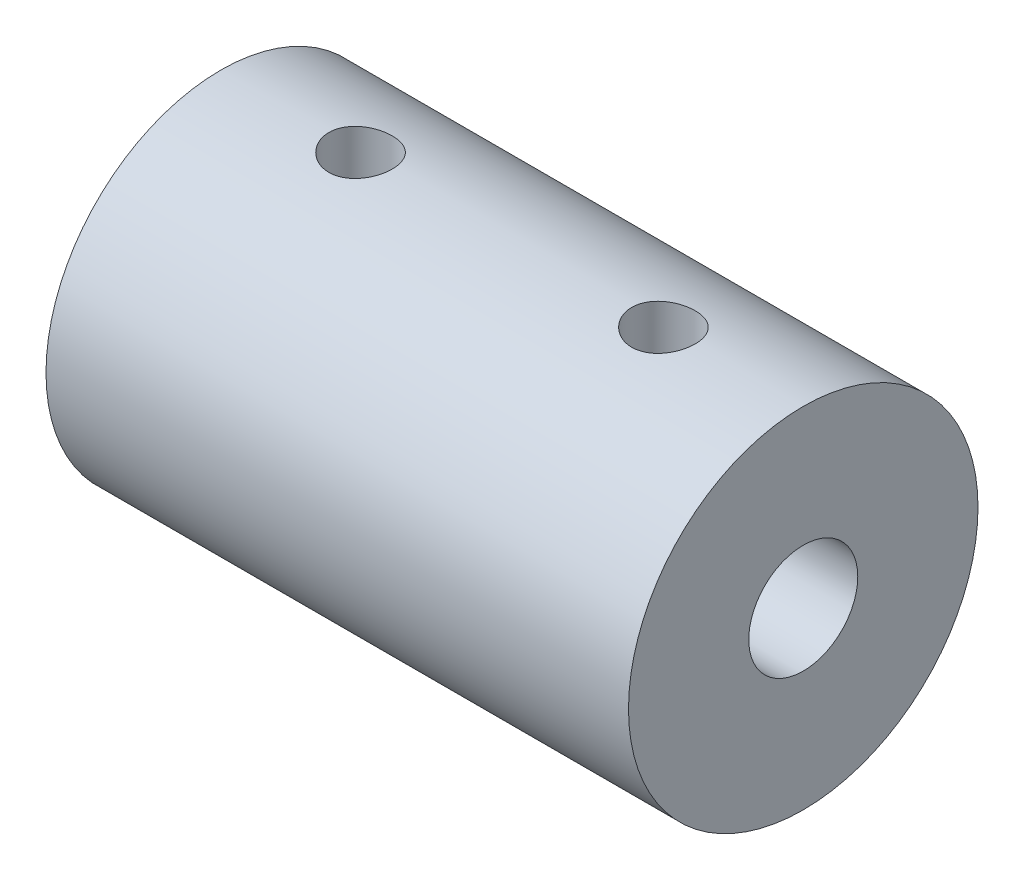
ISO-10303-21;
HEADER;
FILE_DESCRIPTION(('STEP AP214'),'2;1');
FILE_NAME('part.step','',(''),(''),'','','');
FILE_SCHEMA(('AUTOMOTIVE_DESIGN { 1 0 10303 214 1 1 1 1 }'));
ENDSEC;
DATA;
#1=APPLICATION_CONTEXT('core data for automotive mechanical design processes');
#2=APPLICATION_PROTOCOL_DEFINITION('international standard','automotive_design',2000,#1);
#3=PRODUCT_CONTEXT('',#1,'mechanical');
#4=PRODUCT('Part','Part','',(#3));
#5=PRODUCT_RELATED_PRODUCT_CATEGORY('part','',(#4));
#6=PRODUCT_DEFINITION_FORMATION('','',#4);
#7=PRODUCT_DEFINITION_CONTEXT('part definition',#1,'design');
#8=PRODUCT_DEFINITION('design','',#6,#7);
#9=PRODUCT_DEFINITION_SHAPE('','',#8);
#10=(LENGTH_UNIT() NAMED_UNIT(*) SI_UNIT(.MILLI.,.METRE.));
#11=(NAMED_UNIT(*) PLANE_ANGLE_UNIT() SI_UNIT($,.RADIAN.));
#12=(NAMED_UNIT(*) SI_UNIT($,.STERADIAN.) SOLID_ANGLE_UNIT());
#13=UNCERTAINTY_MEASURE_WITH_UNIT(LENGTH_MEASURE(1.E-05),#10,'distance_accuracy_value','');
#14=(GEOMETRIC_REPRESENTATION_CONTEXT(3) GLOBAL_UNCERTAINTY_ASSIGNED_CONTEXT((#13)) GLOBAL_UNIT_ASSIGNED_CONTEXT((#10,
#11,#12)) REPRESENTATION_CONTEXT('',''));
#15=CARTESIAN_POINT('',(0.,0.,0.));
#16=DIRECTION('',(0.,0.,1.));
#17=DIRECTION('',(1.,0.,0.));
#18=AXIS2_PLACEMENT_3D('',#15,#16,#17);
#19=CARTESIAN_POINT('',(15.875,0.,0.));
#20=DIRECTION('',(-1.,0.,0.));
#21=DIRECTION('',(0.,0.,1.));
#22=AXIS2_PLACEMENT_3D('',#19,#20,#21);
#23=CYLINDRICAL_SURFACE('',#22,9.525);
#24=CARTESIAN_POINT('',(-8.255,9.36709160625645,1.72719999999999));
#25=CARTESIAN_POINT('',(-8.35115795474129,9.36709343497364,1.72719625390079));
#26=CARTESIAN_POINT('',(-8.44736520185399,9.36858834082511,1.71914270536416));
#27=CARTESIAN_POINT('',(-8.63707101764501,9.37439961656139,1.68716062987503));
#28=CARTESIAN_POINT('',(-8.73056715290708,9.37871844395448,1.66321827547112));
#29=CARTESIAN_POINT('',(-8.91207824297073,9.38967270270374,1.6002145457144));
#30=CARTESIAN_POINT('',(-9.00009805868919,9.39630604404906,1.56116680710868));
#31=CARTESIAN_POINT('',(-9.16833051207764,9.41113944883253,1.46909622360217));
#32=CARTESIAN_POINT('',(-9.248543840492,9.41933937346351,1.41607461669867));
#33=CARTESIAN_POINT('',(-9.3998276902941,9.43648870802808,1.29690299865099));
#34=CARTESIAN_POINT('',(-9.47079408645016,9.44544504519133,1.23062178201328));
#35=CARTESIAN_POINT('',(-9.6006632394337,9.46303676260904,1.08709600230992));
#36=CARTESIAN_POINT('',(-9.65956522859206,9.47167212241083,1.00985074212138));
#37=CARTESIAN_POINT('',(-9.76403010266554,9.48772286083563,0.845908417592046));
#38=CARTESIAN_POINT('',(-9.80949519272308,9.49512913111047,0.75914806985368));
#39=CARTESIAN_POINT('',(-9.88516607834458,9.50780980092821,0.579064151305445));
#40=CARTESIAN_POINT('',(-9.91537304728019,9.51308436439624,0.485741085807066));
#41=CARTESIAN_POINT('',(-9.95934929684985,9.52085839899594,0.296258940572087));
#42=CARTESIAN_POINT('',(-9.9732939470057,9.52338745615763,0.200141795565415));
#43=CARTESIAN_POINT('',(-9.98489580828946,9.52548739851328,0.00690112682949754));
#44=CARTESIAN_POINT('',(-9.98255432031225,9.52505851997957,-0.0902223159004717));
#45=CARTESIAN_POINT('',(-9.96178556574876,9.52131412657413,-0.28151705155413));
#46=CARTESIAN_POINT('',(-9.94354709762688,9.51803249328916,-0.375709600922653));
#47=CARTESIAN_POINT('',(-9.89180030265221,9.50898923828882,-0.559674826749761));
#48=CARTESIAN_POINT('',(-9.85829144637045,9.50322753058892,-0.649447349845121));
#49=CARTESIAN_POINT('',(-9.77677280931975,9.48981454472941,-0.822576095350367));
#50=CARTESIAN_POINT('',(-9.72868684425516,9.48215337870742,-0.905895648642475));
#51=CARTESIAN_POINT('',(-9.61943500589909,9.46578994716391,-1.06335388456352));
#52=CARTESIAN_POINT('',(-9.55826788551003,9.45708758241411,-1.13749169078174));
#53=CARTESIAN_POINT('',(-9.42354754616279,9.43945949798295,-1.27559962395483));
#54=CARTESIAN_POINT('',(-9.34982919582557,9.43053236513762,-1.33940859362493));
#55=CARTESIAN_POINT('',(-9.19265099867967,9.4135806781254,-1.45378019679795));
#56=CARTESIAN_POINT('',(-9.10919102696789,9.40555613553374,-1.50434266043259));
#57=CARTESIAN_POINT('',(-8.93469331221902,9.39131652514842,-1.59082748215016));
#58=CARTESIAN_POINT('',(-8.84364433842957,9.38510420260575,-1.62672766156755));
#59=CARTESIAN_POINT('',(-8.65666946975143,9.37523540246148,-1.68267680476975));
#60=CARTESIAN_POINT('',(-8.56074409020495,9.37157865538462,-1.70272743985513));
#61=CARTESIAN_POINT('',(-8.36818912967723,9.36728800663201,-1.7261756208229));
#62=CARTESIAN_POINT('',(-8.27158858181781,9.36661218161772,-1.72980414446771));
#63=CARTESIAN_POINT('',(-8.07916152655703,9.36824787109065,-1.72092314584178));
#64=CARTESIAN_POINT('',(-7.98333498368581,9.3705592478946,-1.70841436735625));
#65=CARTESIAN_POINT('',(-7.79592753163355,9.37786995345022,-1.66781172201954));
#66=CARTESIAN_POINT('',(-7.70431974379931,9.38284857668978,-1.63983785607877));
#67=CARTESIAN_POINT('',(-7.52709171950237,9.39491511594552,-1.56922598156164));
#68=CARTESIAN_POINT('',(-7.44147189973352,9.40200317857446,-1.52658695367775));
#69=CARTESIAN_POINT('',(-7.27762946644026,9.41758601931965,-1.42731936031377));
#70=CARTESIAN_POINT('',(-7.1994970458319,9.42609520608484,-1.37054423426629));
#71=CARTESIAN_POINT('',(-7.0537848670088,9.44352050720455,-1.24481479182017));
#72=CARTESIAN_POINT('',(-6.98620599447276,9.45243665563121,-1.17585945426315));
#73=CARTESIAN_POINT('',(-6.86266230694343,9.46980532958425,-1.02669788710214));
#74=CARTESIAN_POINT('',(-6.80685243693567,9.4782507074214,-0.946362361724642));
#75=CARTESIAN_POINT('',(-6.70952198072541,9.49360778801081,-0.777321261465812));
#76=CARTESIAN_POINT('',(-6.66800086999375,9.5005195470577,-0.688615993983514));
#77=CARTESIAN_POINT('',(-6.600661352377,9.5119997827441,-0.505791398298495));
#78=CARTESIAN_POINT('',(-6.57476532541818,9.51657982450963,-0.411701417633637));
#79=CARTESIAN_POINT('',(-6.53916261623354,9.5229297822828,-0.220417190627488));
#80=CARTESIAN_POINT('',(-6.52945434552246,9.52469997401686,-0.123223249828148));
#81=CARTESIAN_POINT('',(-6.52655509281603,9.52522578442471,0.0700211002257293));
#82=CARTESIAN_POINT('',(-6.5331295686287,9.52402420977396,0.166067953481926));
#83=CARTESIAN_POINT('',(-6.56209746266059,9.5188299635943,0.355664671688566));
#84=CARTESIAN_POINT('',(-6.58449074985277,9.51483731518381,0.449214557314702));
#85=CARTESIAN_POINT('',(-6.64436441858851,9.50450894130173,0.631048360872217));
#86=CARTESIAN_POINT('',(-6.68182136680741,9.49817685634161,0.719340214503601));
#87=CARTESIAN_POINT('',(-6.77073163592665,9.4838568277767,0.88842134092432));
#88=CARTESIAN_POINT('',(-6.82218581228916,9.47586878297248,0.969210154748872));
#89=CARTESIAN_POINT('',(-6.93844476760439,9.45898406813173,1.12216470349717));
#90=CARTESIAN_POINT('',(-7.00341973104658,9.45007662637111,1.19419990890147));
#91=CARTESIAN_POINT('',(-7.14452129311012,9.43242700134796,1.32642635353507));
#92=CARTESIAN_POINT('',(-7.22065050546256,9.42368485736257,1.38661480899465));
#93=CARTESIAN_POINT('',(-7.38267800891623,9.40727413159174,1.49392054475152));
#94=CARTESIAN_POINT('',(-7.46865437218685,9.39961538398545,1.54092148039362));
#95=CARTESIAN_POINT('',(-7.64739165336194,9.38635619964863,1.61973853052233));
#96=CARTESIAN_POINT('',(-7.74014595185666,9.38075378605842,1.6515692377648));
#97=CARTESIAN_POINT('',(-7.90350180935456,9.37343285236402,1.69253544616144));
#98=CARTESIAN_POINT('',(-7.97313630309745,9.37106872526291,1.70551282132508));
#99=CARTESIAN_POINT('',(-8.11350498469122,9.3678974481759,1.72284637234295));
#100=CARTESIAN_POINT('',(-8.18423914590635,9.36709026053741,1.72720275668487));
#101=CARTESIAN_POINT('',(-8.255,9.36709160625645,1.72719999999999));
#102=B_SPLINE_CURVE_WITH_KNOTS('',3,(#24,#25,#26,#27,#28,#29,#30,#31,#32,#33,#34,#35,#36,#37,
#38,#39,#40,#41,#42,#43,#44,#45,#46,#47,#48,#49,#50,#51,#52,#53,#54,#55,#56,#57,#58,#59,#60,#61,
#62,#63,#64,#65,#66,#67,#68,#69,#70,#71,#72,#73,#74,#75,#76,#77,#78,#79,#80,#81,#82,#83,#84,#85,
#86,#87,#88,#89,#90,#91,#92,#93,#94,#95,#96,#97,#98,#99,#100,#101),.UNSPECIFIED.,.T.,.F.,(4,2,2,
2,2,2,2,2,2,2,2,2,2,2,2,2,2,2,2,2,2,2,2,2,2,2,2,2,2,2,2,2,2,2,2,2,2,2,4),(0.,0.288214974598148,
0.576681101734833,0.864887414633325,1.15306820283406,1.44425577586372,1.73546187166983,
2.02873795408056,2.32199147970006,2.61205248903672,2.90209032931115,3.18872979732479,
3.47537920397131,3.76355333737475,4.05175495624045,4.3440919037278,4.63643259985227,
4.92921387705486,5.22196427697781,5.51058406708333,5.79919055487447,6.08558841752443,
6.37200619038837,6.6615270725182,6.95107223888284,7.24421952212047,7.53735604300253,
7.82902410885502,8.12066355198245,8.40812662096726,8.69558730892662,8.98260253659226,
9.26963530957831,9.56052692416954,9.8514868115823,10.1449382476361,10.4381068302158,
10.6502040097892,10.8622960599999),.UNSPECIFIED.);
#103=CARTESIAN_POINT('',(-8.255,9.36709160625645,1.72719999999999));
#104=VERTEX_POINT('',#103);
#105=EDGE_CURVE('E98',#104,#104,#102,.T.);
#106=ORIENTED_EDGE('',*,*,#105,.T.);
#107=EDGE_LOOP('',(#106));
#108=FACE_BOUND('',#107,.T.);
#109=CARTESIAN_POINT('',(8.255,9.36709160625645,1.72719999999999));
#110=CARTESIAN_POINT('',(8.15884204525871,9.36709343497364,1.72719625390078));
#111=CARTESIAN_POINT('',(8.06263479814601,9.36858834082511,1.71914270536415));
#112=CARTESIAN_POINT('',(7.87292898235499,9.37439961656139,1.68716062987503));
#113=CARTESIAN_POINT('',(7.77943284709292,9.37871844395448,1.66321827547112));
#114=CARTESIAN_POINT('',(7.59792175702927,9.38967270270374,1.6002145457144));
#115=CARTESIAN_POINT('',(7.50990194131082,9.39630604404906,1.56116680710868));
#116=CARTESIAN_POINT('',(7.34166948792236,9.41113944883253,1.46909622360217));
#117=CARTESIAN_POINT('',(7.261456159508,9.41933937346351,1.41607461669867));
#118=CARTESIAN_POINT('',(7.11017230970591,9.43648870802808,1.29690299865099));
#119=CARTESIAN_POINT('',(7.03920591354985,9.44544504519133,1.23062178201328));
#120=CARTESIAN_POINT('',(6.9093367605663,9.46303676260904,1.08709600230992));
#121=CARTESIAN_POINT('',(6.85043477140794,9.47167212241083,1.00985074212138));
#122=CARTESIAN_POINT('',(6.74596989733447,9.48772286083563,0.845908417592043));
#123=CARTESIAN_POINT('',(6.70050480727693,9.49512913111047,0.759148069853677));
#124=CARTESIAN_POINT('',(6.62483392165543,9.50780980092821,0.579064151305442));
#125=CARTESIAN_POINT('',(6.59462695271982,9.51308436439624,0.485741085807063));
#126=CARTESIAN_POINT('',(6.55065070315015,9.52085839899594,0.296258940572084));
#127=CARTESIAN_POINT('',(6.53670605299431,9.52338745615763,0.200141795565412));
#128=CARTESIAN_POINT('',(6.52510419171055,9.52548739851328,0.00690112682949484));
#129=CARTESIAN_POINT('',(6.52744567968776,9.52505851997957,-0.0902223159004742));
#130=CARTESIAN_POINT('',(6.54821443425124,9.52131412657413,-0.281517051554132));
#131=CARTESIAN_POINT('',(6.56645290237312,9.51803249328916,-0.375709600922655));
#132=CARTESIAN_POINT('',(6.6181996973478,9.50898923828882,-0.559674826749764));
#133=CARTESIAN_POINT('',(6.65170855362956,9.50322753058892,-0.649447349845124));
#134=CARTESIAN_POINT('',(6.73322719068025,9.4898145447294,-0.82257609535037));
#135=CARTESIAN_POINT('',(6.78131315574484,9.48215337870742,-0.905895648642479));
#136=CARTESIAN_POINT('',(6.89056499410091,9.46578994716391,-1.06335388456352));
#137=CARTESIAN_POINT('',(6.95173211448998,9.45708758241411,-1.13749169078174));
#138=CARTESIAN_POINT('',(7.08645245383722,9.43945949798295,-1.27559962395484));
#139=CARTESIAN_POINT('',(7.16017080417444,9.43053236513762,-1.33940859362494));
#140=CARTESIAN_POINT('',(7.31734900132033,9.4135806781254,-1.45378019679795));
#141=CARTESIAN_POINT('',(7.40080897303211,9.40555613553373,-1.50434266043259));
#142=CARTESIAN_POINT('',(7.57530668778098,9.39131652514842,-1.59082748215017));
#143=CARTESIAN_POINT('',(7.66635566157043,9.38510420260575,-1.62672766156755));
#144=CARTESIAN_POINT('',(7.85333053024857,9.37523540246148,-1.68267680476975));
#145=CARTESIAN_POINT('',(7.94925590979506,9.37157865538462,-1.70272743985513));
#146=CARTESIAN_POINT('',(8.14181087032277,9.36728800663201,-1.72617562082291));
#147=CARTESIAN_POINT('',(8.2384114181822,9.36661218161772,-1.72980414446772));
#148=CARTESIAN_POINT('',(8.43083847344298,9.36824787109065,-1.72092314584178));
#149=CARTESIAN_POINT('',(8.52666501631419,9.3705592478946,-1.70841436735626));
#150=CARTESIAN_POINT('',(8.71407246836646,9.37786995345022,-1.66781172201955));
#151=CARTESIAN_POINT('',(8.8056802562007,9.38284857668978,-1.63983785607877));
#152=CARTESIAN_POINT('',(8.98290828049764,9.39491511594552,-1.56922598156164));
#153=CARTESIAN_POINT('',(9.06852810026649,9.40200317857446,-1.52658695367776));
#154=CARTESIAN_POINT('',(9.23237053355974,9.41758601931965,-1.42731936031377));
#155=CARTESIAN_POINT('',(9.3105029541681,9.42609520608484,-1.37054423426629));
#156=CARTESIAN_POINT('',(9.45621513299121,9.44352050720455,-1.24481479182017));
#157=CARTESIAN_POINT('',(9.52379400552724,9.45243665563121,-1.17585945426315));
#158=CARTESIAN_POINT('',(9.64733769305657,9.46980532958425,-1.02669788710214));
#159=CARTESIAN_POINT('',(9.70314756306434,9.4782507074214,-0.946362361724644));
#160=CARTESIAN_POINT('',(9.80047801927459,9.49360778801081,-0.777321261465815));
#161=CARTESIAN_POINT('',(9.84199913000625,9.5005195470577,-0.688615993983518));
#162=CARTESIAN_POINT('',(9.909338647623,9.5119997827441,-0.505791398298499));
#163=CARTESIAN_POINT('',(9.93523467458182,9.51657982450963,-0.411701417633641));
#164=CARTESIAN_POINT('',(9.97083738376646,9.5229297822828,-0.22041719062749));
#165=CARTESIAN_POINT('',(9.98054565447755,9.52469997401686,-0.12322324982815));
#166=CARTESIAN_POINT('',(9.98344490718398,9.52522578442471,0.0700211002257271));
#167=CARTESIAN_POINT('',(9.9768704313713,9.52402420977396,0.166067953481924));
#168=CARTESIAN_POINT('',(9.94790253733941,9.5188299635943,0.355664671688563));
#169=CARTESIAN_POINT('',(9.92550925014723,9.51483731518381,0.449214557314699));
#170=CARTESIAN_POINT('',(9.86563558141149,9.50450894130173,0.631048360872215));
#171=CARTESIAN_POINT('',(9.82817863319259,9.49817685634161,0.719340214503598));
#172=CARTESIAN_POINT('',(9.73926836407335,9.4838568277767,0.888421340924318));
#173=CARTESIAN_POINT('',(9.68781418771085,9.47586878297248,0.969210154748869));
#174=CARTESIAN_POINT('',(9.57155523239561,9.45898406813173,1.12216470349717));
#175=CARTESIAN_POINT('',(9.50658026895343,9.45007662637111,1.19419990890147));
#176=CARTESIAN_POINT('',(9.36547870688989,9.43242700134796,1.32642635353506));
#177=CARTESIAN_POINT('',(9.28934949453745,9.42368485736257,1.38661480899465));
#178=CARTESIAN_POINT('',(9.12732199108378,9.40727413159174,1.49392054475151));
#179=CARTESIAN_POINT('',(9.04134562781315,9.39961538398545,1.54092148039362));
#180=CARTESIAN_POINT('',(8.86260834663806,9.38635619964863,1.61973853052233));
#181=CARTESIAN_POINT('',(8.76985404814335,9.38075378605842,1.65156923776479));
#182=CARTESIAN_POINT('',(8.60649819064544,9.37343285236403,1.69253544616143));
#183=CARTESIAN_POINT('',(8.53686369690256,9.37106872526292,1.70551282132507));
#184=CARTESIAN_POINT('',(8.39649501530878,9.3678974481759,1.72284637234295));
#185=CARTESIAN_POINT('',(8.32576085409365,9.36709026053741,1.72720275668486));
#186=CARTESIAN_POINT('',(8.255,9.36709160625645,1.72719999999999));
#187=B_SPLINE_CURVE_WITH_KNOTS('',3,(#109,#110,#111,#112,#113,#114,#115,#116,#117,#118,#119,
#120,#121,#122,#123,#124,#125,#126,#127,#128,#129,#130,#131,#132,#133,#134,#135,#136,#137,#138,
#139,#140,#141,#142,#143,#144,#145,#146,#147,#148,#149,#150,#151,#152,#153,#154,#155,#156,#157,
#158,#159,#160,#161,#162,#163,#164,#165,#166,#167,#168,#169,#170,#171,#172,#173,#174,#175,#176,
#177,#178,#179,#180,#181,#182,#183,#184,#185,#186),.UNSPECIFIED.,.T.,.F.,(4,2,2,2,2,2,2,2,2,2,2,
2,2,2,2,2,2,2,2,2,2,2,2,2,2,2,2,2,2,2,2,2,2,2,2,2,2,2,4),(0.,0.288214974598149,
0.576681101734833,0.864887414633326,1.15306820283406,1.44425577586372,1.73546187166983,
2.02873795408056,2.32199147970006,2.61205248903672,2.90209032931115,3.18872979732479,
3.47537920397131,3.76355333737475,4.05175495624045,4.3440919037278,4.63643259985227,
4.92921387705486,5.22196427697781,5.51058406708333,5.79919055487446,6.08558841752443,
6.37200619038836,6.6615270725182,6.95107223888284,7.24421952212047,7.53735604300253,
7.82902410885502,8.12066355198245,8.40812662096726,8.69558730892662,8.98260253659226,
9.26963530957831,9.56052692416953,9.8514868115823,10.1449382476361,10.4381068302158,
10.6502040097892,10.8622960599999),.UNSPECIFIED.);
#188=CARTESIAN_POINT('',(8.255,9.36709160625645,1.72719999999999));
#189=VERTEX_POINT('',#188);
#190=EDGE_CURVE('E67',#189,#189,#187,.T.);
#191=ORIENTED_EDGE('',*,*,#190,.T.);
#192=EDGE_LOOP('',(#191));
#193=FACE_BOUND('',#192,.T.);
#194=CARTESIAN_POINT('',(15.875,0.,0.));
#195=DIRECTION('',(1.,0.,0.));
#196=DIRECTION('',(0.,0.,-1.));
#197=AXIS2_PLACEMENT_3D('',#194,#195,#196);
#198=CIRCLE('',#197,9.525);
#199=CARTESIAN_POINT('',(15.875,0.,-9.525));
#200=VERTEX_POINT('',#199);
#201=EDGE_CURVE('E11',#200,#200,#198,.T.);
#202=ORIENTED_EDGE('',*,*,#201,.F.);
#203=EDGE_LOOP('',(#202));
#204=FACE_BOUND('',#203,.T.);
#205=CARTESIAN_POINT('',(-15.875,0.,0.));
#206=DIRECTION('',(1.,0.,0.));
#207=DIRECTION('',(0.,0.,-1.));
#208=AXIS2_PLACEMENT_3D('',#205,#206,#207);
#209=CIRCLE('',#208,9.525);
#210=CARTESIAN_POINT('',(-15.875,0.,-9.525));
#211=VERTEX_POINT('',#210);
#212=EDGE_CURVE('E40',#211,#211,#209,.T.);
#213=ORIENTED_EDGE('',*,*,#212,.T.);
#214=EDGE_LOOP('',(#213));
#215=FACE_BOUND('',#214,.T.);
#216=ADVANCED_FACE('F36',(#108,#193,#204,#215),#23,.T.);
#217=CARTESIAN_POINT('',(15.875,0.,0.));
#218=DIRECTION('',(1.,0.,0.));
#219=DIRECTION('',(0.,0.,-1.));
#220=AXIS2_PLACEMENT_3D('',#217,#218,#219);
#221=PLANE('',#220);
#222=CARTESIAN_POINT('',(15.875,0.,0.));
#223=DIRECTION('',(1.,0.,0.));
#224=DIRECTION('',(0.,0.,-1.));
#225=AXIS2_PLACEMENT_3D('',#222,#223,#224);
#226=CIRCLE('',#225,2.9718);
#227=CARTESIAN_POINT('',(15.875,0.,-2.9718));
#228=VERTEX_POINT('',#227);
#229=EDGE_CURVE('E61',#228,#228,#226,.T.);
#230=ORIENTED_EDGE('',*,*,#229,.F.);
#231=EDGE_LOOP('',(#230));
#232=FACE_BOUND('',#231,.T.);
#233=ORIENTED_EDGE('',*,*,#201,.T.);
#234=EDGE_LOOP('',(#233));
#235=FACE_BOUND('',#234,.T.);
#236=ADVANCED_FACE('F81',(#232,#235),#221,.T.);
#237=CARTESIAN_POINT('',(-15.875,0.,0.));
#238=DIRECTION('',(1.,0.,0.));
#239=DIRECTION('',(0.,0.,-1.));
#240=AXIS2_PLACEMENT_3D('',#237,#238,#239);
#241=PLANE('',#240);
#242=CARTESIAN_POINT('',(-15.875,0.,0.));
#243=DIRECTION('',(-1.,0.,0.));
#244=DIRECTION('',(0.,0.,1.));
#245=AXIS2_PLACEMENT_3D('',#242,#243,#244);
#246=CIRCLE('',#245,2.9718);
#247=CARTESIAN_POINT('',(-15.875,0.,2.9718));
#248=VERTEX_POINT('',#247);
#249=EDGE_CURVE('E60',#248,#248,#246,.T.);
#250=ORIENTED_EDGE('',*,*,#249,.F.);
#251=EDGE_LOOP('',(#250));
#252=FACE_BOUND('',#251,.T.);
#253=ORIENTED_EDGE('',*,*,#212,.F.);
#254=EDGE_LOOP('',(#253));
#255=FACE_BOUND('',#254,.T.);
#256=ADVANCED_FACE('F78',(#252,#255),#241,.F.);
#257=CARTESIAN_POINT('',(-3.175,0.,0.));
#258=DIRECTION('',(-1.,0.,0.));
#259=DIRECTION('',(0.,0.,1.));
#260=AXIS2_PLACEMENT_3D('',#257,#258,#259);
#261=CONICAL_SURFACE('',#260,2.9718,1.02974425867665);
#262=CARTESIAN_POINT('',(-1.3893624123739,0.,0.));
#263=VERTEX_POINT('',#262);
#264=VERTEX_LOOP('',#263);
#265=FACE_BOUND('',#264,.T.);
#266=CARTESIAN_POINT('',(-3.175,0.,0.));
#267=DIRECTION('',(-1.,0.,0.));
#268=DIRECTION('',(0.,0.,1.));
#269=AXIS2_PLACEMENT_3D('',#266,#267,#268);
#270=CIRCLE('',#269,2.9718);
#271=CARTESIAN_POINT('',(-3.175,0.,2.9718));
#272=VERTEX_POINT('',#271);
#273=EDGE_CURVE('E64',#272,#272,#270,.T.);
#274=ORIENTED_EDGE('',*,*,#273,.T.);
#275=EDGE_LOOP('',(#274));
#276=FACE_BOUND('',#275,.T.);
#277=ADVANCED_FACE('F80',(#265,#276),#261,.F.);
#278=CARTESIAN_POINT('',(-15.875,0.,0.));
#279=DIRECTION('',(-1.,0.,0.));
#280=DIRECTION('',(0.,0.,1.));
#281=AXIS2_PLACEMENT_3D('',#278,#279,#280);
#282=CYLINDRICAL_SURFACE('',#281,2.9718);
#283=CARTESIAN_POINT('',(-8.255,2.41834145645316,1.72719999999999));
#284=CARTESIAN_POINT('',(-8.1674441772655,2.41834172813499,1.72720000440107));
#285=CARTESIAN_POINT('',(-8.07988740240988,2.42316794518036,1.72050111793388));
#286=CARTESIAN_POINT('',(-7.90767471403032,2.44164889451718,1.69416402657214));
#287=CARTESIAN_POINT('',(-7.82302189744201,2.45531276130109,1.67451243350902));
#288=CARTESIAN_POINT('',(-7.65945337687474,2.48931145892352,1.62352827063493));
#289=CARTESIAN_POINT('',(-7.58050327569831,2.50960134000961,1.59227421976578));
#290=CARTESIAN_POINT('',(-7.4290052619531,2.5544855709401,1.51922135918414));
#291=CARTESIAN_POINT('',(-7.35645941526623,2.57908130218681,1.47741916351174));
#292=CARTESIAN_POINT('',(-7.21075429881436,2.63319898632037,1.37889851886849));
#293=CARTESIAN_POINT('',(-7.13846693657191,2.66296292370051,1.32102320593202));
#294=CARTESIAN_POINT('',(-7.0039098572587,2.72212215062513,1.19437730296346));
#295=CARTESIAN_POINT('',(-6.94164699469301,2.75151717535896,1.12559932119502));
#296=CARTESIAN_POINT('',(-6.82280696003332,2.81009234883042,0.97081182745958));
#297=CARTESIAN_POINT('',(-6.76740656202427,2.83896190019937,0.883769757677968));
#298=CARTESIAN_POINT('',(-6.67244575861248,2.88985197154789,0.699604055207914));
#299=CARTESIAN_POINT('',(-6.63287178039085,2.91187835662834,0.602489151451031));
#300=CARTESIAN_POINT('',(-6.57450587160105,2.9448109999756,0.41025782297389));
#301=CARTESIAN_POINT('',(-6.55415306006134,2.95654544168665,0.315760779709321));
#302=CARTESIAN_POINT('',(-6.52955759913091,2.97076088240226,0.124035479177824));
#303=CARTESIAN_POINT('',(-6.52530100409034,2.97324989155204,0.026809659724075));
#304=CARTESIAN_POINT('',(-6.53267559662901,2.96896896408568,-0.155406202188568));
#305=CARTESIAN_POINT('',(-6.54251265717017,2.96324447948517,-0.24050145936884));
#306=CARTESIAN_POINT('',(-6.57442610102207,2.94491650265296,-0.40758400526759));
#307=CARTESIAN_POINT('',(-6.59650338708543,2.93231250303786,-0.489571064270761));
#308=CARTESIAN_POINT('',(-6.65214927206103,2.90120170999964,-0.649065589873776));
#309=CARTESIAN_POINT('',(-6.68580729668214,2.8826490597671,-0.726532539384947));
#310=CARTESIAN_POINT('',(-6.76339303979778,2.84116052664881,-0.874837119348315));
#311=CARTESIAN_POINT('',(-6.80732366640242,2.81822340288198,-0.945672864580924));
#312=CARTESIAN_POINT('',(-6.90994122935679,2.7668322426972,-1.08745315913908));
#313=CARTESIAN_POINT('',(-6.96974559443544,2.73804703227916,-1.15746840273225));
#314=CARTESIAN_POINT('',(-7.09951665682707,2.67958181957995,-1.28705171985529));
#315=CARTESIAN_POINT('',(-7.1694961834152,2.64990072573439,-1.34660639177784));
#316=CARTESIAN_POINT('',(-7.32639177341559,2.58938309305375,-1.45987287919061));
#317=CARTESIAN_POINT('',(-7.41431488317622,2.55875299944846,-1.5123126792539));
#318=CARTESIAN_POINT('',(-7.59967070037894,2.50400914250501,-1.60133797151931));
#319=CARTESIAN_POINT('',(-7.69708586906635,2.4798836599704,-1.63795204932389));
#320=CARTESIAN_POINT('',(-7.87507815605494,2.44682872617504,-1.68679557805519));
#321=CARTESIAN_POINT('',(-7.9542214535702,2.43565907567278,-1.70273612445793));
#322=CARTESIAN_POINT('',(-8.11463466926864,2.42110007728305,-1.72337996681153));
#323=CARTESIAN_POINT('',(-8.19590232108282,2.41770275468644,-1.72809478100048));
#324=CARTESIAN_POINT('',(-8.35827527746477,2.41918190893165,-1.7260227196997));
#325=CARTESIAN_POINT('',(-8.43938038934156,2.4240653097924,-1.71922621890158));
#326=CARTESIAN_POINT('',(-8.59906117210198,2.44139993586138,-1.69451496791867));
#327=CARTESIAN_POINT('',(-8.67763489672267,2.45385684434471,-1.67659186795174));
#328=CARTESIAN_POINT('',(-8.83105120553308,2.48485502174216,-1.6302957883898));
#329=CARTESIAN_POINT('',(-8.9058577377063,2.50344554776539,-1.60183797438486));
#330=CARTESIAN_POINT('',(-9.04991443091523,2.54469854307762,-1.53545738991797));
#331=CARTESIAN_POINT('',(-9.11916236878377,2.56736262996984,-1.49753085710993));
#332=CARTESIAN_POINT('',(-9.26269028227341,2.6188903979455,-1.40578233295355));
#333=CARTESIAN_POINT('',(-9.33580080864364,2.64815106783761,-1.35035043982414));
#334=CARTESIAN_POINT('',(-9.47239369430095,2.70677186169335,-1.22863800524688));
#335=CARTESIAN_POINT('',(-9.53586753552313,2.73613205046132,-1.16234797240954));
#336=CARTESIAN_POINT('',(-9.65834719069571,2.79545714054072,-1.01204171033505));
#337=CARTESIAN_POINT('',(-9.71610000926248,2.8251353720488,-0.926878830302339));
#338=CARTESIAN_POINT('',(-9.81614721251668,2.8781513883414,-0.746112838835355));
#339=CARTESIAN_POINT('',(-9.85845330237904,2.90149397067805,-0.650517704375273));
#340=CARTESIAN_POINT('',(-9.92276617089177,2.93754476280059,-0.459469649168239));
#341=CARTESIAN_POINT('',(-9.94611375733952,2.95094801638241,-0.364603416553487));
#342=CARTESIAN_POINT('',(-9.97643597318162,2.96842672083316,-0.171478426107669));
#343=CARTESIAN_POINT('',(-9.98342637856424,2.97251115931207,-0.0732230299292901));
#344=CARTESIAN_POINT('',(-9.98078815985216,2.97098086126568,0.110912407544109));
#345=CARTESIAN_POINT('',(-9.97308592515019,2.96649033115933,0.196837539266016));
#346=CARTESIAN_POINT('',(-9.94516446413481,2.9504068553987,0.365931191220004));
#347=CARTESIAN_POINT('',(-9.92494473222307,2.93881362285703,0.449099599961421));
#348=CARTESIAN_POINT('',(-9.8730172050533,2.90962166145585,0.610233073039898));
#349=CARTESIAN_POINT('',(-9.84135514574084,2.89204685749823,0.688217409585096));
#350=CARTESIAN_POINT('',(-9.76768248445162,2.85230130694816,0.837838005591312));
#351=CARTESIAN_POINT('',(-9.72566924718353,2.83012939021157,0.909472642166532));
#352=CARTESIAN_POINT('',(-9.62728127533138,2.78020473479213,1.05282042570669));
#353=CARTESIAN_POINT('',(-9.56983574537978,2.75210646978409,1.12367729309926));
#354=CARTESIAN_POINT('',(-9.44481534230774,2.69461535884837,1.25531457640192));
#355=CARTESIAN_POINT('',(-9.37722849867576,2.66522101241222,1.31608290310452));
#356=CARTESIAN_POINT('',(-9.22486187120016,2.60453103056273,1.4327608640491));
#357=CARTESIAN_POINT('',(-9.13900335167323,2.57339334676279,1.48735548677065));
#358=CARTESIAN_POINT('',(-8.95754292219433,2.51685522988378,1.58115398228163));
#359=CARTESIAN_POINT('',(-8.8619539632467,2.49144731184992,1.62037798417156));
#360=CARTESIAN_POINT('',(-8.68149842578803,2.45437970237249,1.67586500079034));
#361=CARTESIAN_POINT('',(-8.59786850585045,2.44105539783905,1.6950154785252));
#362=CARTESIAN_POINT('',(-8.42782357954561,2.42304162517298,1.72067494651081));
#363=CARTESIAN_POINT('',(-8.3414122534789,2.41834118831978,1.7271999956564));
#364=CARTESIAN_POINT('',(-8.255,2.41834145645316,1.72719999999999));
#365=B_SPLINE_CURVE_WITH_KNOTS('',3,(#283,#284,#285,#286,#287,#288,#289,#290,#291,#292,#293,
#294,#295,#296,#297,#298,#299,#300,#301,#302,#303,#304,#305,#306,#307,#308,#309,#310,#311,#312,
#313,#314,#315,#316,#317,#318,#319,#320,#321,#322,#323,#324,#325,#326,#327,#328,#329,#330,#331,
#332,#333,#334,#335,#336,#337,#338,#339,#340,#341,#342,#343,#344,#345,#346,#347,#348,#349,#350,
#351,#352,#353,#354,#355,#356,#357,#358,#359,#360,#361,#362,#363,#364),.UNSPECIFIED.,.T.,.F.,(4,
2,2,2,2,2,2,2,2,2,2,2,2,2,2,2,2,2,2,2,2,2,2,2,2,2,2,2,2,2,2,2,2,2,2,2,2,2,2,2,4),(0.,
0.262305648539934,0.524882847351873,0.785714536539891,1.04663005958302,1.33727408900151,
1.6281160172572,1.9478102253928,2.26722967114389,2.55764244205039,2.84780354363062,
3.10414194407336,3.36049925274214,3.61888229446846,3.87733857158086,4.16559731149403,
4.45422270359626,4.77318403462924,5.09156680144749,5.33500867672334,5.57820065897735,
5.82159608919749,6.06517439287093,6.31075844658594,6.55644023758529,6.84420005413653,
7.13221276490289,7.45180485430857,7.77115425908744,8.06524703487013,8.35905605027149,
8.61696297158133,8.87488031077394,9.13177793281453,9.38874102575245,9.67393950737806,
9.9594773164541,10.2771274881485,10.5943602692268,10.8535698542746,11.1124495207854),.UNSPECIFIED.);
#366=CARTESIAN_POINT('',(-8.255,2.41834145645316,1.72719999999999));
#367=VERTEX_POINT('',#366);
#368=EDGE_CURVE('E136',#367,#367,#365,.T.);
#369=ORIENTED_EDGE('',*,*,#368,.T.);
#370=EDGE_LOOP('',(#369));
#371=FACE_BOUND('',#370,.T.);
#372=ORIENTED_EDGE('',*,*,#273,.F.);
#373=EDGE_LOOP('',(#372));
#374=FACE_BOUND('',#373,.T.);
#375=ORIENTED_EDGE('',*,*,#249,.T.);
#376=EDGE_LOOP('',(#375));
#377=FACE_BOUND('',#376,.T.);
#378=ADVANCED_FACE('F54',(#371,#374,#377),#282,.F.);
#379=CARTESIAN_POINT('',(3.175,0.,0.));
#380=DIRECTION('',(1.,0.,0.));
#381=DIRECTION('',(0.,0.,-1.));
#382=AXIS2_PLACEMENT_3D('',#379,#380,#381);
#383=CONICAL_SURFACE('',#382,2.9718,1.02974425867665);
#384=CARTESIAN_POINT('',(1.3893624123739,0.,0.));
#385=VERTEX_POINT('',#384);
#386=VERTEX_LOOP('',#385);
#387=FACE_BOUND('',#386,.T.);
#388=CARTESIAN_POINT('',(3.175,0.,0.));
#389=DIRECTION('',(1.,0.,0.));
#390=DIRECTION('',(0.,0.,-1.));
#391=AXIS2_PLACEMENT_3D('',#388,#389,#390);
#392=CIRCLE('',#391,2.9718);
#393=CARTESIAN_POINT('',(3.175,0.,-2.9718));
#394=VERTEX_POINT('',#393);
#395=EDGE_CURVE('E58',#394,#394,#392,.T.);
#396=ORIENTED_EDGE('',*,*,#395,.T.);
#397=EDGE_LOOP('',(#396));
#398=FACE_BOUND('',#397,.T.);
#399=ADVANCED_FACE('F50',(#387,#398),#383,.F.);
#400=CARTESIAN_POINT('',(15.875,0.,0.));
#401=DIRECTION('',(1.,0.,0.));
#402=DIRECTION('',(0.,0.,-1.));
#403=AXIS2_PLACEMENT_3D('',#400,#401,#402);
#404=CYLINDRICAL_SURFACE('',#403,2.9718);
#405=CARTESIAN_POINT('',(8.255,2.41834145645317,1.72719999999999));
#406=CARTESIAN_POINT('',(8.3425558227345,2.418341728135,1.72720000440107));
#407=CARTESIAN_POINT('',(8.43011259759013,2.42316794518037,1.72050111793387));
#408=CARTESIAN_POINT('',(8.60232528596968,2.44164889451719,1.69416402657214));
#409=CARTESIAN_POINT('',(8.68697810255799,2.45531276130109,1.67451243350901));
#410=CARTESIAN_POINT('',(8.85054662312526,2.48931145892352,1.62352827063493));
#411=CARTESIAN_POINT('',(8.92949672430169,2.50960134000962,1.59227421976577));
#412=CARTESIAN_POINT('',(9.0809947380469,2.55448557094011,1.51922135918413));
#413=CARTESIAN_POINT('',(9.15354058473378,2.57908130218681,1.47741916351174));
#414=CARTESIAN_POINT('',(9.29924570118565,2.63319898632037,1.37889851886848));
#415=CARTESIAN_POINT('',(9.3715330634281,2.66296292370051,1.32102320593202));
#416=CARTESIAN_POINT('',(9.50609014274131,2.72212215062514,1.19437730296346));
#417=CARTESIAN_POINT('',(9.568353005307,2.75151717535896,1.12559932119502));
#418=CARTESIAN_POINT('',(9.68719303996669,2.81009234883042,0.970811827459575));
#419=CARTESIAN_POINT('',(9.74259343797573,2.83896190019937,0.883769757677962));
#420=CARTESIAN_POINT('',(9.83755424138753,2.88985197154789,0.699604055207909));
#421=CARTESIAN_POINT('',(9.87712821960915,2.91187835662834,0.602489151451026));
#422=CARTESIAN_POINT('',(9.93549412839895,2.9448109999756,0.410257822973885));
#423=CARTESIAN_POINT('',(9.95584693993866,2.95654544168666,0.315760779709317));
#424=CARTESIAN_POINT('',(9.98044240086909,2.97076088240226,0.12403547917782));
#425=CARTESIAN_POINT('',(9.98469899590966,2.97324989155204,0.0268096597240708));
#426=CARTESIAN_POINT('',(9.97732440337099,2.96896896408568,-0.155406202188572));
#427=CARTESIAN_POINT('',(9.96748734282983,2.96324447948517,-0.240501459368843));
#428=CARTESIAN_POINT('',(9.93557389897793,2.94491650265296,-0.407584005267594));
#429=CARTESIAN_POINT('',(9.91349661291458,2.93231250303786,-0.489571064270765));
#430=CARTESIAN_POINT('',(9.85785072793897,2.90120170999964,-0.64906558987378));
#431=CARTESIAN_POINT('',(9.82419270331787,2.8826490597671,-0.726532539384951));
#432=CARTESIAN_POINT('',(9.74660696020222,2.84116052664881,-0.874837119348319));
#433=CARTESIAN_POINT('',(9.70267633359758,2.81822340288198,-0.945672864580928));
#434=CARTESIAN_POINT('',(9.60005877064322,2.7668322426972,-1.08745315913908));
#435=CARTESIAN_POINT('',(9.54025440556456,2.73804703227916,-1.15746840273225));
#436=CARTESIAN_POINT('',(9.41048334317293,2.67958181957995,-1.2870517198553));
#437=CARTESIAN_POINT('',(9.3405038165848,2.64990072573439,-1.34660639177784));
#438=CARTESIAN_POINT('',(9.18360822658441,2.58938309305375,-1.45987287919061));
#439=CARTESIAN_POINT('',(9.09568511682378,2.55875299944845,-1.5123126792539));
#440=CARTESIAN_POINT('',(8.91032929962106,2.50400914250501,-1.60133797151932));
#441=CARTESIAN_POINT('',(8.81291413093365,2.47988365997039,-1.63795204932389));
#442=CARTESIAN_POINT('',(8.63492184394506,2.44682872617504,-1.68679557805519));
#443=CARTESIAN_POINT('',(8.5557785464298,2.43565907567278,-1.70273612445794));
#444=CARTESIAN_POINT('',(8.39536533073136,2.42110007728305,-1.72337996681153));
#445=CARTESIAN_POINT('',(8.31409767891718,2.41770275468644,-1.72809478100048));
#446=CARTESIAN_POINT('',(8.15172472253523,2.41918190893165,-1.72602271969971));
#447=CARTESIAN_POINT('',(8.07061961065844,2.4240653097924,-1.71922621890158));
#448=CARTESIAN_POINT('',(7.91093882789802,2.44139993586138,-1.69451496791867));
#449=CARTESIAN_POINT('',(7.83236510327733,2.45385684434471,-1.67659186795174));
#450=CARTESIAN_POINT('',(7.67894879446692,2.48485502174216,-1.63029578838981));
#451=CARTESIAN_POINT('',(7.6041422622937,2.50344554776539,-1.60183797438486));
#452=CARTESIAN_POINT('',(7.46008556908477,2.54469854307762,-1.53545738991797));
#453=CARTESIAN_POINT('',(7.39083763121623,2.56736262996984,-1.49753085710993));
#454=CARTESIAN_POINT('',(7.24730971772659,2.6188903979455,-1.40578233295355));
#455=CARTESIAN_POINT('',(7.17419919135636,2.64815106783761,-1.35035043982414));
#456=CARTESIAN_POINT('',(7.03760630569905,2.70677186169335,-1.22863800524688));
#457=CARTESIAN_POINT('',(6.97413246447687,2.73613205046132,-1.16234797240955));
#458=CARTESIAN_POINT('',(6.85165280930429,2.79545714054072,-1.01204171033505));
#459=CARTESIAN_POINT('',(6.79389999073752,2.8251353720488,-0.926878830302338));
#460=CARTESIAN_POINT('',(6.69385278748332,2.8781513883414,-0.746112838835355));
#461=CARTESIAN_POINT('',(6.65154669762096,2.90149397067805,-0.650517704375273));
#462=CARTESIAN_POINT('',(6.58723382910824,2.93754476280059,-0.45946964916824));
#463=CARTESIAN_POINT('',(6.56388624266049,2.95094801638241,-0.364603416553488));
#464=CARTESIAN_POINT('',(6.53356402681838,2.96842672083316,-0.171478426107671));
#465=CARTESIAN_POINT('',(6.52657362143577,2.97251115931207,-0.0732230299292911));
#466=CARTESIAN_POINT('',(6.52921184014784,2.97098086126568,0.110912407544109));
#467=CARTESIAN_POINT('',(6.53691407484981,2.96649033115933,0.196837539266015));
#468=CARTESIAN_POINT('',(6.56483553586519,2.9504068553987,0.365931191220004));
#469=CARTESIAN_POINT('',(6.58505526777694,2.93881362285703,0.44909959996142));
#470=CARTESIAN_POINT('',(6.63698279494671,2.90962166145585,0.610233073039897));
#471=CARTESIAN_POINT('',(6.66864485425917,2.89204685749823,0.688217409585095));
#472=CARTESIAN_POINT('',(6.74231751554838,2.85230130694816,0.837838005591311));
#473=CARTESIAN_POINT('',(6.78433075281648,2.83012939021157,0.909472642166531));
#474=CARTESIAN_POINT('',(6.88271872466862,2.78020473479213,1.05282042570669));
#475=CARTESIAN_POINT('',(6.94016425462023,2.75210646978409,1.12367729309926));
#476=CARTESIAN_POINT('',(7.06518465769226,2.69461535884837,1.25531457640192));
#477=CARTESIAN_POINT('',(7.13277150132425,2.66522101241222,1.31608290310452));
#478=CARTESIAN_POINT('',(7.28513812879985,2.60453103056274,1.43276086404909));
#479=CARTESIAN_POINT('',(7.37099664832677,2.57339334676279,1.48735548677065));
#480=CARTESIAN_POINT('',(7.55245707780567,2.51685522988378,1.58115398228163));
#481=CARTESIAN_POINT('',(7.6480460367533,2.49144731184992,1.62037798417155));
#482=CARTESIAN_POINT('',(7.82850157421198,2.45437970237249,1.67586500079034));
#483=CARTESIAN_POINT('',(7.91213149414955,2.44105539783905,1.6950154785252));
#484=CARTESIAN_POINT('',(8.08217642045439,2.42304162517298,1.72067494651081));
#485=CARTESIAN_POINT('',(8.1685877465211,2.41834118831978,1.7271999956564));
#486=CARTESIAN_POINT('',(8.255,2.41834145645317,1.72719999999999));
#487=B_SPLINE_CURVE_WITH_KNOTS('',3,(#405,#406,#407,#408,#409,#410,#411,#412,#413,#414,#415,
#416,#417,#418,#419,#420,#421,#422,#423,#424,#425,#426,#427,#428,#429,#430,#431,#432,#433,#434,
#435,#436,#437,#438,#439,#440,#441,#442,#443,#444,#445,#446,#447,#448,#449,#450,#451,#452,#453,
#454,#455,#456,#457,#458,#459,#460,#461,#462,#463,#464,#465,#466,#467,#468,#469,#470,#471,#472,
#473,#474,#475,#476,#477,#478,#479,#480,#481,#482,#483,#484,#485,#486),.UNSPECIFIED.,.T.,.F.,(4,
2,2,2,2,2,2,2,2,2,2,2,2,2,2,2,2,2,2,2,2,2,2,2,2,2,2,2,2,2,2,2,2,2,2,2,2,2,2,2,4),(0.,
0.262305648539936,0.524882847351874,0.785714536539891,1.04663005958302,1.33727408900151,
1.62811601725721,1.94781022539281,2.26722967114389,2.55764244205039,2.84780354363062,
3.10414194407336,3.36049925274214,3.61888229446846,3.87733857158086,4.16559731149403,
4.45422270359626,4.77318403462925,5.09156680144749,5.33500867672334,5.57820065897735,
5.82159608919749,6.06517439287093,6.31075844658594,6.55644023758529,6.84420005413654,
7.13221276490289,7.45180485430858,7.77115425908744,8.06524703487014,8.35905605027149,
8.61696297158133,8.87488031077394,9.13177793281453,9.38874102575245,9.67393950737806,
9.9594773164541,10.2771274881485,10.5943602692268,10.8535698542746,11.1124495207853),.UNSPECIFIED.);
#488=CARTESIAN_POINT('',(8.255,2.41834145645317,1.72719999999999));
#489=VERTEX_POINT('',#488);
#490=EDGE_CURVE('E105',#489,#489,#487,.T.);
#491=ORIENTED_EDGE('',*,*,#490,.T.);
#492=EDGE_LOOP('',(#491));
#493=FACE_BOUND('',#492,.T.);
#494=ORIENTED_EDGE('',*,*,#395,.F.);
#495=EDGE_LOOP('',(#494));
#496=FACE_BOUND('',#495,.T.);
#497=ORIENTED_EDGE('',*,*,#229,.T.);
#498=EDGE_LOOP('',(#497));
#499=FACE_BOUND('',#498,.T.);
#500=ADVANCED_FACE('F53',(#493,#496,#499),#404,.F.);
#501=CARTESIAN_POINT('',(8.255,9.525,0.));
#502=DIRECTION('',(0.,1.,0.));
#503=DIRECTION('',(0.,0.,1.));
#504=AXIS2_PLACEMENT_3D('',#501,#502,#503);
#505=CYLINDRICAL_SURFACE('',#504,1.72719999999999);
#506=ORIENTED_EDGE('',*,*,#490,.F.);
#507=EDGE_LOOP('',(#506));
#508=FACE_BOUND('',#507,.T.);
#509=ORIENTED_EDGE('',*,*,#190,.F.);
#510=EDGE_LOOP('',(#509));
#511=FACE_BOUND('',#510,.T.);
#512=ADVANCED_FACE('F115',(#508,#511),#505,.F.);
#513=CARTESIAN_POINT('',(-8.255,9.525,0.));
#514=DIRECTION('',(0.,1.,0.));
#515=DIRECTION('',(0.,0.,1.));
#516=AXIS2_PLACEMENT_3D('',#513,#514,#515);
#517=CYLINDRICAL_SURFACE('',#516,1.72719999999999);
#518=ORIENTED_EDGE('',*,*,#368,.F.);
#519=EDGE_LOOP('',(#518));
#520=FACE_BOUND('',#519,.T.);
#521=ORIENTED_EDGE('',*,*,#105,.F.);
#522=EDGE_LOOP('',(#521));
#523=FACE_BOUND('',#522,.T.);
#524=ADVANCED_FACE('F119',(#520,#523),#517,.F.);
#525=CLOSED_SHELL('',(#216,#236,#256,#277,#378,#399,#500,#512,#524));
#526=MANIFOLD_SOLID_BREP('B2',#525);
#527=ADVANCED_BREP_SHAPE_REPRESENTATION('',(#18,#526),#14);
#528=SHAPE_DEFINITION_REPRESENTATION(#9,#527);
ENDSEC;
END-ISO-10303-21;
